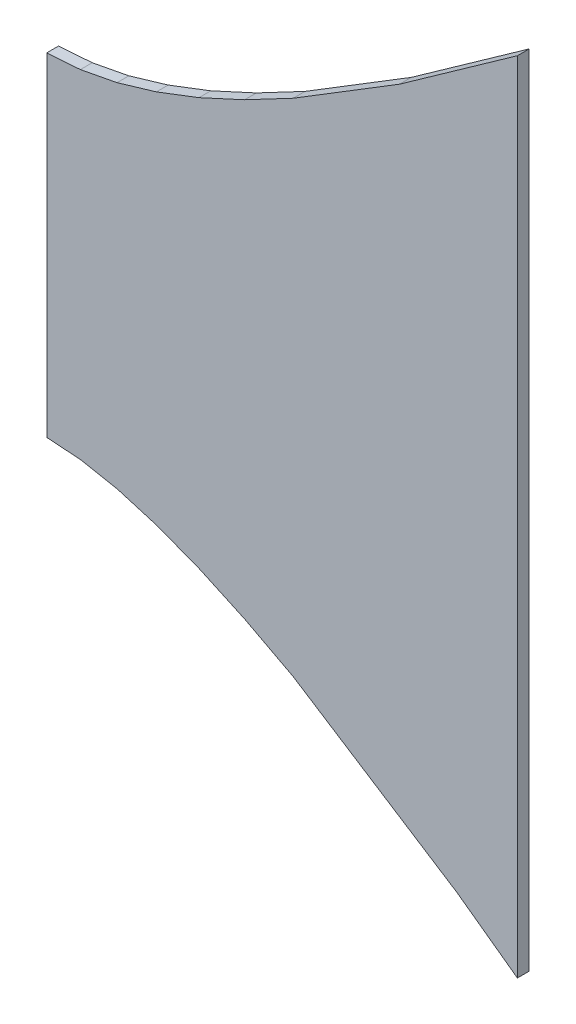
ISO-10303-21;
HEADER;
FILE_DESCRIPTION(('STEP AP214'),'2;1');
FILE_NAME('part.step','',(''),(''),'','','');
FILE_SCHEMA(('AUTOMOTIVE_DESIGN { 1 0 10303 214 1 1 1 1 }'));
ENDSEC;
DATA;
#1=APPLICATION_CONTEXT('core data for automotive mechanical design processes');
#2=APPLICATION_PROTOCOL_DEFINITION('international standard','automotive_design',2000,#1);
#3=PRODUCT_CONTEXT('',#1,'mechanical');
#4=PRODUCT('Part','Part','',(#3));
#5=PRODUCT_RELATED_PRODUCT_CATEGORY('part','',(#4));
#6=PRODUCT_DEFINITION_FORMATION('','',#4);
#7=PRODUCT_DEFINITION_CONTEXT('part definition',#1,'design');
#8=PRODUCT_DEFINITION('design','',#6,#7);
#9=PRODUCT_DEFINITION_SHAPE('','',#8);
#10=(LENGTH_UNIT() NAMED_UNIT(*) SI_UNIT(.MILLI.,.METRE.));
#11=(NAMED_UNIT(*) PLANE_ANGLE_UNIT() SI_UNIT($,.RADIAN.));
#12=(NAMED_UNIT(*) SI_UNIT($,.STERADIAN.) SOLID_ANGLE_UNIT());
#13=UNCERTAINTY_MEASURE_WITH_UNIT(LENGTH_MEASURE(1.E-05),#10,'distance_accuracy_value','');
#14=(GEOMETRIC_REPRESENTATION_CONTEXT(3) GLOBAL_UNCERTAINTY_ASSIGNED_CONTEXT((#13)) GLOBAL_UNIT_ASSIGNED_CONTEXT((#10,
#11,#12)) REPRESENTATION_CONTEXT('',''));
#15=CARTESIAN_POINT('',(0.,0.,0.));
#16=DIRECTION('',(0.,0.,1.));
#17=DIRECTION('',(1.,0.,0.));
#18=AXIS2_PLACEMENT_3D('',#15,#16,#17);
#19=CARTESIAN_POINT('',(80.5859985351563,42.,0.));
#20=DIRECTION('',(0.0691421856130917,0.997606815418101,0.));
#21=DIRECTION('',(0.997606815418101,-0.0691421856130917,0.));
#22=AXIS2_PLACEMENT_3D('',#19,#20,#21);
#23=PLANE('',#22);
#24=DIRECTION('',(0.997606815418101,-0.0691421856130917,0.));
#25=VECTOR('',#24,1.);
#26=CARTESIAN_POINT('',(80.5859985351563,42.,0.03556));
#27=LINE('',#26,#25);
#28=CARTESIAN_POINT('',(80.5859985351563,42.,0.03556));
#29=VERTEX_POINT('',#28);
#30=CARTESIAN_POINT('',(80.6869964599609,41.9930000305176,0.03556));
#31=VERTEX_POINT('',#30);
#32=EDGE_CURVE('E11',#29,#31,#27,.T.);
#33=ORIENTED_EDGE('',*,*,#32,.F.);
#34=DIRECTION('',(0.,0.,1.));
#35=VECTOR('',#34,1.);
#36=CARTESIAN_POINT('',(80.5859985351563,42.,0.));
#37=LINE('',#36,#35);
#38=CARTESIAN_POINT('',(80.5859985351563,42.,0.));
#39=VERTEX_POINT('',#38);
#40=EDGE_CURVE('E24',#39,#29,#37,.T.);
#41=ORIENTED_EDGE('',*,*,#40,.F.);
#42=DIRECTION('',(0.997606815418101,-0.0691421856130917,0.));
#43=VECTOR('',#42,1.);
#44=CARTESIAN_POINT('',(80.5859985351563,42.,0.));
#45=LINE('',#44,#43);
#46=CARTESIAN_POINT('',(80.6869964599609,41.9930000305176,0.));
#47=VERTEX_POINT('',#46);
#48=EDGE_CURVE('E160',#39,#47,#45,.T.);
#49=ORIENTED_EDGE('',*,*,#48,.T.);
#50=DIRECTION('',(0.,0.,1.));
#51=VECTOR('',#50,1.);
#52=CARTESIAN_POINT('',(80.6869964599609,41.9930000305176,0.));
#53=LINE('',#52,#51);
#54=EDGE_CURVE('E37',#47,#31,#53,.T.);
#55=ORIENTED_EDGE('',*,*,#54,.T.);
#56=EDGE_LOOP('',(#33,#41,#49,#55));
#57=FACE_BOUND('',#56,.T.);
#58=ADVANCED_FACE('F17',(#57),#23,.F.);
#59=CARTESIAN_POINT('',(80.6869964599609,41.9930000305176,0.));
#60=DIRECTION('',(0.18752063241692,0.982260664191516,0.));
#61=DIRECTION('',(0.982260664191516,-0.18752063241692,0.));
#62=AXIS2_PLACEMENT_3D('',#59,#60,#61);
#63=PLANE('',#62);
#64=DIRECTION('',(0.982260664191516,-0.18752063241692,0.));
#65=VECTOR('',#64,1.);
#66=CARTESIAN_POINT('',(80.6869964599609,41.9930000305176,0.03556));
#67=LINE('',#66,#65);
#68=CARTESIAN_POINT('',(80.7969970703125,41.9720001220703,0.03556));
#69=VERTEX_POINT('',#68);
#70=EDGE_CURVE('E280',#31,#69,#67,.T.);
#71=ORIENTED_EDGE('',*,*,#70,.F.);
#72=ORIENTED_EDGE('',*,*,#54,.F.);
#73=DIRECTION('',(0.982260664191516,-0.18752063241692,0.));
#74=VECTOR('',#73,1.);
#75=CARTESIAN_POINT('',(80.6869964599609,41.9930000305176,0.));
#76=LINE('',#75,#74);
#77=CARTESIAN_POINT('',(80.7969970703125,41.9720001220703,0.));
#78=VERTEX_POINT('',#77);
#79=EDGE_CURVE('E277',#47,#78,#76,.T.);
#80=ORIENTED_EDGE('',*,*,#79,.T.);
#81=DIRECTION('',(0.,0.,1.));
#82=VECTOR('',#81,1.);
#83=CARTESIAN_POINT('',(80.7969970703125,41.9720001220703,0.));
#84=LINE('',#83,#82);
#85=EDGE_CURVE('E275',#78,#69,#84,.T.);
#86=ORIENTED_EDGE('',*,*,#85,.T.);
#87=EDGE_LOOP('',(#71,#72,#80,#86));
#88=FACE_BOUND('',#87,.T.);
#89=ADVANCED_FACE('F288',(#88),#63,.F.);
#90=CARTESIAN_POINT('',(80.7969970703125,41.9720001220703,0.));
#91=DIRECTION('',(0.284355291061929,0.958718972611414,0.));
#92=DIRECTION('',(0.958718972611414,-0.284355291061929,0.));
#93=AXIS2_PLACEMENT_3D('',#90,#91,#92);
#94=PLANE('',#93);
#95=DIRECTION('',(0.958718972611414,-0.284355291061929,0.));
#96=VECTOR('',#95,1.);
#97=CARTESIAN_POINT('',(80.7969970703125,41.9720001220703,0.03556));
#98=LINE('',#97,#96);
#99=CARTESIAN_POINT('',(80.9150009155273,41.9370002746582,0.03556));
#100=VERTEX_POINT('',#99);
#101=EDGE_CURVE('E272',#69,#100,#98,.T.);
#102=ORIENTED_EDGE('',*,*,#101,.F.);
#103=ORIENTED_EDGE('',*,*,#85,.F.);
#104=DIRECTION('',(0.958718972611414,-0.284355291061929,0.));
#105=VECTOR('',#104,1.);
#106=CARTESIAN_POINT('',(80.7969970703125,41.9720001220703,0.));
#107=LINE('',#106,#105);
#108=CARTESIAN_POINT('',(80.9150009155273,41.9370002746582,0.));
#109=VERTEX_POINT('',#108);
#110=EDGE_CURVE('E269',#78,#109,#107,.T.);
#111=ORIENTED_EDGE('',*,*,#110,.T.);
#112=DIRECTION('',(0.,0.,1.));
#113=VECTOR('',#112,1.);
#114=CARTESIAN_POINT('',(80.9150009155273,41.9370002746582,0.));
#115=LINE('',#114,#113);
#116=EDGE_CURVE('E267',#109,#100,#115,.T.);
#117=ORIENTED_EDGE('',*,*,#116,.T.);
#118=EDGE_LOOP('',(#102,#103,#111,#117));
#119=FACE_BOUND('',#118,.T.);
#120=ADVANCED_FACE('F294',(#119),#94,.F.);
#121=CARTESIAN_POINT('',(80.9150009155273,41.9370002746582,0.));
#122=DIRECTION('',(0.357514537183552,0.933907573425995,0.));
#123=DIRECTION('',(0.933907573425995,-0.357514537183552,0.));
#124=AXIS2_PLACEMENT_3D('',#121,#122,#123);
#125=PLANE('',#124);
#126=DIRECTION('',(0.933907573425995,-0.357514537183552,0.));
#127=VECTOR('',#126,1.);
#128=CARTESIAN_POINT('',(80.9150009155273,41.9370002746582,0.03556));
#129=LINE('',#128,#127);
#130=CARTESIAN_POINT('',(81.0429992675781,41.8880004882812,0.03556));
#131=VERTEX_POINT('',#130);
#132=EDGE_CURVE('E264',#100,#131,#129,.T.);
#133=ORIENTED_EDGE('',*,*,#132,.F.);
#134=ORIENTED_EDGE('',*,*,#116,.F.);
#135=DIRECTION('',(0.933907573425995,-0.357514537183552,0.));
#136=VECTOR('',#135,1.);
#137=CARTESIAN_POINT('',(80.9150009155273,41.9370002746582,0.));
#138=LINE('',#137,#136);
#139=CARTESIAN_POINT('',(81.0429992675781,41.8880004882812,0.));
#140=VERTEX_POINT('',#139);
#141=EDGE_CURVE('E261',#109,#140,#138,.T.);
#142=ORIENTED_EDGE('',*,*,#141,.T.);
#143=DIRECTION('',(0.,0.,1.));
#144=VECTOR('',#143,1.);
#145=CARTESIAN_POINT('',(81.0429992675781,41.8880004882812,0.));
#146=LINE('',#145,#144);
#147=EDGE_CURVE('E259',#140,#131,#146,.T.);
#148=ORIENTED_EDGE('',*,*,#147,.T.);
#149=EDGE_LOOP('',(#133,#134,#142,#148));
#150=FACE_BOUND('',#149,.T.);
#151=ADVANCED_FACE('F296',(#150),#125,.F.);
#152=CARTESIAN_POINT('',(81.0429992675781,41.8880004882812,0.));
#153=DIRECTION('',(0.417792019909642,0.908542694703898,0.));
#154=DIRECTION('',(0.908542694703898,-0.417792019909642,0.));
#155=AXIS2_PLACEMENT_3D('',#152,#153,#154);
#156=PLANE('',#155);
#157=DIRECTION('',(0.908542694703898,-0.417792019909642,0.));
#158=VECTOR('',#157,1.);
#159=CARTESIAN_POINT('',(81.0429992675781,41.8880004882812,0.03556));
#160=LINE('',#159,#158);
#161=CARTESIAN_POINT('',(81.1800003051758,41.8250007629395,0.03556));
#162=VERTEX_POINT('',#161);
#163=EDGE_CURVE('E256',#131,#162,#160,.T.);
#164=ORIENTED_EDGE('',*,*,#163,.F.);
#165=ORIENTED_EDGE('',*,*,#147,.F.);
#166=DIRECTION('',(0.908542694703898,-0.417792019909642,0.));
#167=VECTOR('',#166,1.);
#168=CARTESIAN_POINT('',(81.0429992675781,41.8880004882812,0.));
#169=LINE('',#168,#167);
#170=CARTESIAN_POINT('',(81.1800003051758,41.8250007629395,0.));
#171=VERTEX_POINT('',#170);
#172=EDGE_CURVE('E253',#140,#171,#169,.T.);
#173=ORIENTED_EDGE('',*,*,#172,.T.);
#174=DIRECTION('',(0.,0.,1.));
#175=VECTOR('',#174,1.);
#176=CARTESIAN_POINT('',(81.1800003051758,41.8250007629395,0.));
#177=LINE('',#176,#175);
#178=EDGE_CURVE('E251',#171,#162,#177,.T.);
#179=ORIENTED_EDGE('',*,*,#178,.T.);
#180=EDGE_LOOP('',(#164,#165,#173,#179));
#181=FACE_BOUND('',#180,.T.);
#182=ADVANCED_FACE('F301',(#181),#156,.F.);
#183=CARTESIAN_POINT('',(81.1800003051758,41.8250007629395,0.));
#184=DIRECTION('',(0.466503523978456,0.88451933959393,0.));
#185=DIRECTION('',(0.88451933959393,-0.466503523978456,0.));
#186=AXIS2_PLACEMENT_3D('',#183,#184,#185);
#187=PLANE('',#186);
#188=DIRECTION('',(0.88451933959393,-0.466503523978456,0.));
#189=VECTOR('',#188,1.);
#190=CARTESIAN_POINT('',(81.1800003051758,41.8250007629395,0.03556));
#191=LINE('',#190,#189);
#192=CARTESIAN_POINT('',(81.3259963989258,41.7480010986328,0.03556));
#193=VERTEX_POINT('',#192);
#194=EDGE_CURVE('E248',#162,#193,#191,.T.);
#195=ORIENTED_EDGE('',*,*,#194,.F.);
#196=ORIENTED_EDGE('',*,*,#178,.F.);
#197=DIRECTION('',(0.88451933959393,-0.466503523978456,0.));
#198=VECTOR('',#197,1.);
#199=CARTESIAN_POINT('',(81.1800003051758,41.8250007629395,0.));
#200=LINE('',#199,#198);
#201=CARTESIAN_POINT('',(81.3259963989258,41.7480010986328,0.));
#202=VERTEX_POINT('',#201);
#203=EDGE_CURVE('E245',#171,#202,#200,.T.);
#204=ORIENTED_EDGE('',*,*,#203,.T.);
#205=DIRECTION('',(0.,0.,1.));
#206=VECTOR('',#205,1.);
#207=CARTESIAN_POINT('',(81.3259963989258,41.7480010986328,0.));
#208=LINE('',#207,#206);
#209=EDGE_CURVE('E243',#202,#193,#208,.T.);
#210=ORIENTED_EDGE('',*,*,#209,.T.);
#211=EDGE_LOOP('',(#195,#196,#204,#210));
#212=FACE_BOUND('',#211,.T.);
#213=ADVANCED_FACE('F304',(#212),#187,.F.);
#214=CARTESIAN_POINT('',(81.3259963989258,41.7480010986328,0.));
#215=DIRECTION('',(0.539976721051199,0.841679951479656,0.));
#216=DIRECTION('',(0.841679951479656,-0.539976721051199,0.));
#217=AXIS2_PLACEMENT_3D('',#214,#215,#216);
#218=PLANE('',#217);
#219=DIRECTION('',(0.841679951479656,-0.539976721051199,0.));
#220=VECTOR('',#219,1.);
#221=CARTESIAN_POINT('',(81.3259963989258,41.7480010986328,0.03556));
#222=LINE('',#221,#220);
#223=CARTESIAN_POINT('',(81.8170013427734,41.4329986572266,0.03556));
#224=VERTEX_POINT('',#223);
#225=EDGE_CURVE('E240',#193,#224,#222,.T.);
#226=ORIENTED_EDGE('',*,*,#225,.F.);
#227=ORIENTED_EDGE('',*,*,#209,.F.);
#228=DIRECTION('',(0.841679951479656,-0.539976721051199,0.));
#229=VECTOR('',#228,1.);
#230=CARTESIAN_POINT('',(81.3259963989258,41.7480010986328,0.));
#231=LINE('',#230,#229);
#232=CARTESIAN_POINT('',(81.8170013427734,41.4329986572266,0.));
#233=VERTEX_POINT('',#232);
#234=EDGE_CURVE('E237',#202,#233,#231,.T.);
#235=ORIENTED_EDGE('',*,*,#234,.T.);
#236=DIRECTION('',(0.,0.,1.));
#237=VECTOR('',#236,1.);
#238=CARTESIAN_POINT('',(81.8170013427734,41.4329986572266,0.));
#239=LINE('',#238,#237);
#240=EDGE_CURVE('E235',#233,#224,#239,.T.);
#241=ORIENTED_EDGE('',*,*,#240,.T.);
#242=EDGE_LOOP('',(#226,#227,#235,#241));
#243=FACE_BOUND('',#242,.T.);
#244=ADVANCED_FACE('F309',(#243),#218,.F.);
#245=CARTESIAN_POINT('',(81.8170013427734,41.4329986572266,0.));
#246=DIRECTION('',(0.587114921003167,0.809503594516692,0.));
#247=DIRECTION('',(0.809503594516692,-0.587114921003167,0.));
#248=AXIS2_PLACEMENT_3D('',#245,#246,#247);
#249=PLANE('',#248);
#250=DIRECTION('',(0.809503594516692,-0.587114921003167,0.));
#251=VECTOR('',#250,1.);
#252=CARTESIAN_POINT('',(81.8170013427734,41.4329986572266,0.03556));
#253=LINE('',#252,#251);
#254=CARTESIAN_POINT('',(81.9990005493164,41.3009986877441,0.03556));
#255=VERTEX_POINT('',#254);
#256=EDGE_CURVE('E232',#224,#255,#253,.T.);
#257=ORIENTED_EDGE('',*,*,#256,.F.);
#258=ORIENTED_EDGE('',*,*,#240,.F.);
#259=DIRECTION('',(0.809503594516692,-0.587114921003167,0.));
#260=VECTOR('',#259,1.);
#261=CARTESIAN_POINT('',(81.8170013427734,41.4329986572266,0.));
#262=LINE('',#261,#260);
#263=CARTESIAN_POINT('',(81.9990005493164,41.3009986877441,0.));
#264=VERTEX_POINT('',#263);
#265=EDGE_CURVE('E229',#233,#264,#262,.T.);
#266=ORIENTED_EDGE('',*,*,#265,.T.);
#267=DIRECTION('',(0.,0.,1.));
#268=VECTOR('',#267,1.);
#269=CARTESIAN_POINT('',(81.9990005493164,41.3009986877441,0.));
#270=LINE('',#269,#268);
#271=EDGE_CURVE('E227',#264,#255,#270,.T.);
#272=ORIENTED_EDGE('',*,*,#271,.T.);
#273=EDGE_LOOP('',(#257,#258,#266,#272));
#274=FACE_BOUND('',#273,.T.);
#275=ADVANCED_FACE('F312',(#274),#249,.F.);
#276=CARTESIAN_POINT('',(81.9990005493164,41.3009986877442,0.));
#277=DIRECTION('',(-1.,0.,0.));
#278=DIRECTION('',(0.,1.,0.));
#279=AXIS2_PLACEMENT_3D('',#276,#277,#278);
#280=PLANE('',#279);
#281=DIRECTION('',(0.,1.,0.));
#282=VECTOR('',#281,1.);
#283=CARTESIAN_POINT('',(81.9990005493164,41.3009986877441,0.03556));
#284=LINE('',#283,#282);
#285=CARTESIAN_POINT('',(81.9990005493164,43.6990013122559,0.03556));
#286=VERTEX_POINT('',#285);
#287=EDGE_CURVE('E224',#255,#286,#284,.T.);
#288=ORIENTED_EDGE('',*,*,#287,.F.);
#289=ORIENTED_EDGE('',*,*,#271,.F.);
#290=DIRECTION('',(0.,1.,0.));
#291=VECTOR('',#290,1.);
#292=CARTESIAN_POINT('',(81.9990005493164,41.3009986877441,0.));
#293=LINE('',#292,#291);
#294=CARTESIAN_POINT('',(81.9990005493164,43.6990013122559,0.));
#295=VERTEX_POINT('',#294);
#296=EDGE_CURVE('E221',#264,#295,#293,.T.);
#297=ORIENTED_EDGE('',*,*,#296,.T.);
#298=DIRECTION('',(0.,0.,1.));
#299=VECTOR('',#298,1.);
#300=CARTESIAN_POINT('',(81.9990005493164,43.6990013122559,0.));
#301=LINE('',#300,#299);
#302=EDGE_CURVE('E219',#295,#286,#301,.T.);
#303=ORIENTED_EDGE('',*,*,#302,.T.);
#304=EDGE_LOOP('',(#288,#289,#297,#303));
#305=FACE_BOUND('',#304,.T.);
#306=ADVANCED_FACE('F317',(#305),#280,.F.);
#307=CARTESIAN_POINT('',(81.9990005493164,43.6990013122559,0.));
#308=DIRECTION('',(0.578395807712451,-0.815756268514476,0.));
#309=DIRECTION('',(-0.815756268514476,-0.578395807712451,0.));
#310=AXIS2_PLACEMENT_3D('',#307,#308,#309);
#311=PLANE('',#310);
#312=DIRECTION('',(-0.815756268514476,-0.578395807712451,0.));
#313=VECTOR('',#312,1.);
#314=CARTESIAN_POINT('',(81.9990005493164,43.6990013122559,0.03556));
#315=LINE('',#314,#313);
#316=CARTESIAN_POINT('',(81.6449966430664,43.4480018615723,0.03556));
#317=VERTEX_POINT('',#316);
#318=EDGE_CURVE('E216',#286,#317,#315,.T.);
#319=ORIENTED_EDGE('',*,*,#318,.F.);
#320=ORIENTED_EDGE('',*,*,#302,.F.);
#321=DIRECTION('',(-0.815756268514476,-0.578395807712451,0.));
#322=VECTOR('',#321,1.);
#323=CARTESIAN_POINT('',(81.9990005493164,43.6990013122559,0.));
#324=LINE('',#323,#322);
#325=CARTESIAN_POINT('',(81.6449966430664,43.4480018615723,0.));
#326=VERTEX_POINT('',#325);
#327=EDGE_CURVE('E213',#295,#326,#324,.T.);
#328=ORIENTED_EDGE('',*,*,#327,.T.);
#329=DIRECTION('',(0.,0.,1.));
#330=VECTOR('',#329,1.);
#331=CARTESIAN_POINT('',(81.6449966430664,43.4480018615723,0.));
#332=LINE('',#331,#330);
#333=EDGE_CURVE('E211',#326,#317,#332,.T.);
#334=ORIENTED_EDGE('',*,*,#333,.T.);
#335=EDGE_LOOP('',(#319,#320,#328,#334));
#336=FACE_BOUND('',#335,.T.);
#337=ADVANCED_FACE('F320',(#336),#311,.F.);
#338=CARTESIAN_POINT('',(81.6449966430664,43.4480018615723,0.));
#339=DIRECTION('',(0.523506659924223,-0.852021582481914,0.));
#340=DIRECTION('',(-0.852021582481914,-0.523506659924223,0.));
#341=AXIS2_PLACEMENT_3D('',#338,#339,#340);
#342=PLANE('',#341);
#343=DIRECTION('',(-0.852021582481914,-0.523506659924223,0.));
#344=VECTOR('',#343,1.);
#345=CARTESIAN_POINT('',(81.6449966430664,43.4480018615723,0.03556));
#346=LINE('',#345,#344);
#347=CARTESIAN_POINT('',(81.3259963989258,43.2519989013672,0.03556));
#348=VERTEX_POINT('',#347);
#349=EDGE_CURVE('E208',#317,#348,#346,.T.);
#350=ORIENTED_EDGE('',*,*,#349,.F.);
#351=ORIENTED_EDGE('',*,*,#333,.F.);
#352=DIRECTION('',(-0.852021582481914,-0.523506659924223,0.));
#353=VECTOR('',#352,1.);
#354=CARTESIAN_POINT('',(81.6449966430664,43.4480018615723,0.));
#355=LINE('',#354,#353);
#356=CARTESIAN_POINT('',(81.3259963989258,43.2519989013672,0.));
#357=VERTEX_POINT('',#356);
#358=EDGE_CURVE('E205',#326,#357,#355,.T.);
#359=ORIENTED_EDGE('',*,*,#358,.T.);
#360=DIRECTION('',(0.,0.,1.));
#361=VECTOR('',#360,1.);
#362=CARTESIAN_POINT('',(81.3259963989258,43.2519989013672,0.));
#363=LINE('',#362,#361);
#364=EDGE_CURVE('E203',#357,#348,#363,.T.);
#365=ORIENTED_EDGE('',*,*,#364,.T.);
#366=EDGE_LOOP('',(#350,#351,#359,#365));
#367=FACE_BOUND('',#366,.T.);
#368=ADVANCED_FACE('F325',(#367),#342,.F.);
#369=CARTESIAN_POINT('',(81.3259963989258,43.2519989013672,0.));
#370=DIRECTION('',(0.466503523978456,-0.88451933959393,0.));
#371=DIRECTION('',(-0.88451933959393,-0.466503523978456,0.));
#372=AXIS2_PLACEMENT_3D('',#369,#370,#371);
#373=PLANE('',#372);
#374=DIRECTION('',(-0.88451933959393,-0.466503523978456,0.));
#375=VECTOR('',#374,1.);
#376=CARTESIAN_POINT('',(81.3259963989258,43.2519989013672,0.03556));
#377=LINE('',#376,#375);
#378=CARTESIAN_POINT('',(81.1800003051758,43.1749992370605,0.03556));
#379=VERTEX_POINT('',#378);
#380=EDGE_CURVE('E200',#348,#379,#377,.T.);
#381=ORIENTED_EDGE('',*,*,#380,.F.);
#382=ORIENTED_EDGE('',*,*,#364,.F.);
#383=DIRECTION('',(-0.88451933959393,-0.466503523978456,0.));
#384=VECTOR('',#383,1.);
#385=CARTESIAN_POINT('',(81.3259963989258,43.2519989013672,0.));
#386=LINE('',#385,#384);
#387=CARTESIAN_POINT('',(81.1800003051758,43.1749992370605,0.));
#388=VERTEX_POINT('',#387);
#389=EDGE_CURVE('E197',#357,#388,#386,.T.);
#390=ORIENTED_EDGE('',*,*,#389,.T.);
#391=DIRECTION('',(0.,0.,1.));
#392=VECTOR('',#391,1.);
#393=CARTESIAN_POINT('',(81.1800003051758,43.1749992370605,0.));
#394=LINE('',#393,#392);
#395=EDGE_CURVE('E195',#388,#379,#394,.T.);
#396=ORIENTED_EDGE('',*,*,#395,.T.);
#397=EDGE_LOOP('',(#381,#382,#390,#396));
#398=FACE_BOUND('',#397,.T.);
#399=ADVANCED_FACE('F328',(#398),#373,.F.);
#400=CARTESIAN_POINT('',(81.1800003051758,43.1749992370605,0.));
#401=DIRECTION('',(0.417792019909642,-0.908542694703898,0.));
#402=DIRECTION('',(-0.908542694703898,-0.417792019909642,0.));
#403=AXIS2_PLACEMENT_3D('',#400,#401,#402);
#404=PLANE('',#403);
#405=DIRECTION('',(-0.908542694703898,-0.417792019909642,0.));
#406=VECTOR('',#405,1.);
#407=CARTESIAN_POINT('',(81.1800003051758,43.1749992370605,0.03556));
#408=LINE('',#407,#406);
#409=CARTESIAN_POINT('',(81.0429992675781,43.1119995117188,0.03556));
#410=VERTEX_POINT('',#409);
#411=EDGE_CURVE('E192',#379,#410,#408,.T.);
#412=ORIENTED_EDGE('',*,*,#411,.F.);
#413=ORIENTED_EDGE('',*,*,#395,.F.);
#414=DIRECTION('',(-0.908542694703898,-0.417792019909642,0.));
#415=VECTOR('',#414,1.);
#416=CARTESIAN_POINT('',(81.1800003051758,43.1749992370605,0.));
#417=LINE('',#416,#415);
#418=CARTESIAN_POINT('',(81.0429992675781,43.1119995117188,0.));
#419=VERTEX_POINT('',#418);
#420=EDGE_CURVE('E189',#388,#419,#417,.T.);
#421=ORIENTED_EDGE('',*,*,#420,.T.);
#422=DIRECTION('',(0.,0.,1.));
#423=VECTOR('',#422,1.);
#424=CARTESIAN_POINT('',(81.0429992675781,43.1119995117188,0.));
#425=LINE('',#424,#423);
#426=EDGE_CURVE('E187',#419,#410,#425,.T.);
#427=ORIENTED_EDGE('',*,*,#426,.T.);
#428=EDGE_LOOP('',(#412,#413,#421,#427));
#429=FACE_BOUND('',#428,.T.);
#430=ADVANCED_FACE('F333',(#429),#404,.F.);
#431=CARTESIAN_POINT('',(81.0429992675781,43.1119995117188,0.));
#432=DIRECTION('',(0.357514537183552,-0.933907573425995,0.));
#433=DIRECTION('',(-0.933907573425995,-0.357514537183552,0.));
#434=AXIS2_PLACEMENT_3D('',#431,#432,#433);
#435=PLANE('',#434);
#436=DIRECTION('',(-0.933907573425995,-0.357514537183552,0.));
#437=VECTOR('',#436,1.);
#438=CARTESIAN_POINT('',(81.0429992675781,43.1119995117188,0.03556));
#439=LINE('',#438,#437);
#440=CARTESIAN_POINT('',(80.9150009155273,43.0629997253418,0.03556));
#441=VERTEX_POINT('',#440);
#442=EDGE_CURVE('E184',#410,#441,#439,.T.);
#443=ORIENTED_EDGE('',*,*,#442,.F.);
#444=ORIENTED_EDGE('',*,*,#426,.F.);
#445=DIRECTION('',(-0.933907573425995,-0.357514537183552,0.));
#446=VECTOR('',#445,1.);
#447=CARTESIAN_POINT('',(81.0429992675781,43.1119995117188,0.));
#448=LINE('',#447,#446);
#449=CARTESIAN_POINT('',(80.9150009155273,43.0629997253418,0.));
#450=VERTEX_POINT('',#449);
#451=EDGE_CURVE('E181',#419,#450,#448,.T.);
#452=ORIENTED_EDGE('',*,*,#451,.T.);
#453=DIRECTION('',(0.,0.,1.));
#454=VECTOR('',#453,1.);
#455=CARTESIAN_POINT('',(80.9150009155273,43.0629997253418,0.));
#456=LINE('',#455,#454);
#457=EDGE_CURVE('E179',#450,#441,#456,.T.);
#458=ORIENTED_EDGE('',*,*,#457,.T.);
#459=EDGE_LOOP('',(#443,#444,#452,#458));
#460=FACE_BOUND('',#459,.T.);
#461=ADVANCED_FACE('F336',(#460),#435,.F.);
#462=CARTESIAN_POINT('',(80.9150009155273,43.0629997253418,0.));
#463=DIRECTION('',(0.284355291061929,-0.958718972611414,0.));
#464=DIRECTION('',(-0.958718972611414,-0.284355291061929,0.));
#465=AXIS2_PLACEMENT_3D('',#462,#463,#464);
#466=PLANE('',#465);
#467=DIRECTION('',(-0.958718972611414,-0.284355291061929,0.));
#468=VECTOR('',#467,1.);
#469=CARTESIAN_POINT('',(80.9150009155273,43.0629997253418,0.03556));
#470=LINE('',#469,#468);
#471=CARTESIAN_POINT('',(80.7969970703125,43.0279998779297,0.03556));
#472=VERTEX_POINT('',#471);
#473=EDGE_CURVE('E176',#441,#472,#470,.T.);
#474=ORIENTED_EDGE('',*,*,#473,.F.);
#475=ORIENTED_EDGE('',*,*,#457,.F.);
#476=DIRECTION('',(-0.958718972611414,-0.284355291061929,0.));
#477=VECTOR('',#476,1.);
#478=CARTESIAN_POINT('',(80.9150009155273,43.0629997253418,0.));
#479=LINE('',#478,#477);
#480=CARTESIAN_POINT('',(80.7969970703125,43.0279998779297,0.));
#481=VERTEX_POINT('',#480);
#482=EDGE_CURVE('E173',#450,#481,#479,.T.);
#483=ORIENTED_EDGE('',*,*,#482,.T.);
#484=DIRECTION('',(0.,0.,1.));
#485=VECTOR('',#484,1.);
#486=CARTESIAN_POINT('',(80.7969970703125,43.0279998779297,0.));
#487=LINE('',#486,#485);
#488=EDGE_CURVE('E171',#481,#472,#487,.T.);
#489=ORIENTED_EDGE('',*,*,#488,.T.);
#490=EDGE_LOOP('',(#474,#475,#483,#489));
#491=FACE_BOUND('',#490,.T.);
#492=ADVANCED_FACE('F341',(#491),#466,.F.);
#493=CARTESIAN_POINT('',(80.7969970703125,43.0279998779297,0.));
#494=DIRECTION('',(0.18752063241692,-0.982260664191516,0.));
#495=DIRECTION('',(-0.982260664191516,-0.18752063241692,0.));
#496=AXIS2_PLACEMENT_3D('',#493,#494,#495);
#497=PLANE('',#496);
#498=DIRECTION('',(-0.982260664191516,-0.18752063241692,0.));
#499=VECTOR('',#498,1.);
#500=CARTESIAN_POINT('',(80.7969970703125,43.0279998779297,0.03556));
#501=LINE('',#500,#499);
#502=CARTESIAN_POINT('',(80.6869964599609,43.0069999694824,0.03556));
#503=VERTEX_POINT('',#502);
#504=EDGE_CURVE('E168',#472,#503,#501,.T.);
#505=ORIENTED_EDGE('',*,*,#504,.F.);
#506=ORIENTED_EDGE('',*,*,#488,.F.);
#507=DIRECTION('',(-0.982260664191516,-0.18752063241692,0.));
#508=VECTOR('',#507,1.);
#509=CARTESIAN_POINT('',(80.7969970703125,43.0279998779297,0.));
#510=LINE('',#509,#508);
#511=CARTESIAN_POINT('',(80.6869964599609,43.0069999694824,0.));
#512=VERTEX_POINT('',#511);
#513=EDGE_CURVE('E166',#481,#512,#510,.T.);
#514=ORIENTED_EDGE('',*,*,#513,.T.);
#515=DIRECTION('',(0.,0.,1.));
#516=VECTOR('',#515,1.);
#517=CARTESIAN_POINT('',(80.6869964599609,43.0069999694824,0.));
#518=LINE('',#517,#516);
#519=EDGE_CURVE('E151',#512,#503,#518,.T.);
#520=ORIENTED_EDGE('',*,*,#519,.T.);
#521=EDGE_LOOP('',(#505,#506,#514,#520));
#522=FACE_BOUND('',#521,.T.);
#523=ADVANCED_FACE('F343',(#522),#497,.F.);
#524=CARTESIAN_POINT('',(80.6869964599609,43.0069999694824,0.));
#525=DIRECTION('',(0.0691421856130917,-0.997606815418101,0.));
#526=DIRECTION('',(-0.997606815418101,-0.0691421856130917,0.));
#527=AXIS2_PLACEMENT_3D('',#524,#525,#526);
#528=PLANE('',#527);
#529=DIRECTION('',(-0.997606815418101,-0.0691421856130917,0.));
#530=VECTOR('',#529,1.);
#531=CARTESIAN_POINT('',(80.6869964599609,43.0069999694824,0.03556));
#532=LINE('',#531,#530);
#533=CARTESIAN_POINT('',(80.5859985351563,43.,0.03556));
#534=VERTEX_POINT('',#533);
#535=EDGE_CURVE('E155',#503,#534,#532,.T.);
#536=ORIENTED_EDGE('',*,*,#535,.F.);
#537=ORIENTED_EDGE('',*,*,#519,.F.);
#538=DIRECTION('',(-0.997606815418101,-0.0691421856130917,0.));
#539=VECTOR('',#538,1.);
#540=CARTESIAN_POINT('',(80.6869964599609,43.0069999694824,0.));
#541=LINE('',#540,#539);
#542=CARTESIAN_POINT('',(80.5859985351563,43.,0.));
#543=VERTEX_POINT('',#542);
#544=EDGE_CURVE('E147',#512,#543,#541,.T.);
#545=ORIENTED_EDGE('',*,*,#544,.T.);
#546=DIRECTION('',(0.,0.,1.));
#547=VECTOR('',#546,1.);
#548=CARTESIAN_POINT('',(80.5859985351563,43.,0.));
#549=LINE('',#548,#547);
#550=EDGE_CURVE('E137',#543,#534,#549,.T.);
#551=ORIENTED_EDGE('',*,*,#550,.T.);
#552=EDGE_LOOP('',(#536,#537,#545,#551));
#553=FACE_BOUND('',#552,.T.);
#554=ADVANCED_FACE('F150',(#553),#528,.F.);
#555=CARTESIAN_POINT('',(80.5859985351563,43.,0.));
#556=DIRECTION('',(1.,0.,0.));
#557=DIRECTION('',(0.,-1.,0.));
#558=AXIS2_PLACEMENT_3D('',#555,#556,#557);
#559=PLANE('',#558);
#560=DIRECTION('',(0.,-1.,0.));
#561=VECTOR('',#560,1.);
#562=CARTESIAN_POINT('',(80.5859985351563,43.,0.03556));
#563=LINE('',#562,#561);
#564=EDGE_CURVE('E143',#534,#29,#563,.T.);
#565=ORIENTED_EDGE('',*,*,#564,.F.);
#566=ORIENTED_EDGE('',*,*,#550,.F.);
#567=DIRECTION('',(0.,-1.,0.));
#568=VECTOR('',#567,1.);
#569=CARTESIAN_POINT('',(80.5859985351563,43.,0.));
#570=LINE('',#569,#568);
#571=EDGE_CURVE('E141',#543,#39,#570,.T.);
#572=ORIENTED_EDGE('',*,*,#571,.T.);
#573=ORIENTED_EDGE('',*,*,#40,.T.);
#574=EDGE_LOOP('',(#565,#566,#572,#573));
#575=FACE_BOUND('',#574,.T.);
#576=ADVANCED_FACE('F139',(#575),#559,.F.);
#577=CARTESIAN_POINT('',(80.5859985351563,42.,0.));
#578=DIRECTION('',(0.,0.,1.));
#579=DIRECTION('',(1.,0.,0.));
#580=AXIS2_PLACEMENT_3D('',#577,#578,#579);
#581=PLANE('',#580);
#582=ORIENTED_EDGE('',*,*,#571,.F.);
#583=ORIENTED_EDGE('',*,*,#544,.F.);
#584=ORIENTED_EDGE('',*,*,#513,.F.);
#585=ORIENTED_EDGE('',*,*,#482,.F.);
#586=ORIENTED_EDGE('',*,*,#451,.F.);
#587=ORIENTED_EDGE('',*,*,#420,.F.);
#588=ORIENTED_EDGE('',*,*,#389,.F.);
#589=ORIENTED_EDGE('',*,*,#358,.F.);
#590=ORIENTED_EDGE('',*,*,#327,.F.);
#591=ORIENTED_EDGE('',*,*,#296,.F.);
#592=ORIENTED_EDGE('',*,*,#265,.F.);
#593=ORIENTED_EDGE('',*,*,#234,.F.);
#594=ORIENTED_EDGE('',*,*,#203,.F.);
#595=ORIENTED_EDGE('',*,*,#172,.F.);
#596=ORIENTED_EDGE('',*,*,#141,.F.);
#597=ORIENTED_EDGE('',*,*,#110,.F.);
#598=ORIENTED_EDGE('',*,*,#79,.F.);
#599=ORIENTED_EDGE('',*,*,#48,.F.);
#600=EDGE_LOOP('',(#582,#583,#584,#585,#586,#587,#588,#589,#590,#591,#592,#593,#594,#595,#596,
#597,#598,#599));
#601=FACE_BOUND('',#600,.T.);
#602=ADVANCED_FACE('F158',(#601),#581,.F.);
#603=CARTESIAN_POINT('',(80.5859985351563,42.,0.03556));
#604=DIRECTION('',(0.,0.,1.));
#605=DIRECTION('',(1.,0.,0.));
#606=AXIS2_PLACEMENT_3D('',#603,#604,#605);
#607=PLANE('',#606);
#608=ORIENTED_EDGE('',*,*,#32,.T.);
#609=ORIENTED_EDGE('',*,*,#70,.T.);
#610=ORIENTED_EDGE('',*,*,#101,.T.);
#611=ORIENTED_EDGE('',*,*,#132,.T.);
#612=ORIENTED_EDGE('',*,*,#163,.T.);
#613=ORIENTED_EDGE('',*,*,#194,.T.);
#614=ORIENTED_EDGE('',*,*,#225,.T.);
#615=ORIENTED_EDGE('',*,*,#256,.T.);
#616=ORIENTED_EDGE('',*,*,#287,.T.);
#617=ORIENTED_EDGE('',*,*,#318,.T.);
#618=ORIENTED_EDGE('',*,*,#349,.T.);
#619=ORIENTED_EDGE('',*,*,#380,.T.);
#620=ORIENTED_EDGE('',*,*,#411,.T.);
#621=ORIENTED_EDGE('',*,*,#442,.T.);
#622=ORIENTED_EDGE('',*,*,#473,.T.);
#623=ORIENTED_EDGE('',*,*,#504,.T.);
#624=ORIENTED_EDGE('',*,*,#535,.T.);
#625=ORIENTED_EDGE('',*,*,#564,.T.);
#626=EDGE_LOOP('',(#608,#609,#610,#611,#612,#613,#614,#615,#616,#617,#618,#619,#620,#621,#622,
#623,#624,#625));
#627=FACE_BOUND('',#626,.T.);
#628=ADVANCED_FACE('F291',(#627),#607,.T.);
#629=CLOSED_SHELL('',(#58,#89,#120,#151,#182,#213,#244,#275,#306,#337,#368,#399,#430,#461,#492,
#523,#554,#576,#602,#628));
#630=MANIFOLD_SOLID_BREP('B1',#629);
#631=ADVANCED_BREP_SHAPE_REPRESENTATION('',(#18,#630),#14);
#632=SHAPE_DEFINITION_REPRESENTATION(#9,#631);
ENDSEC;
END-ISO-10303-21;
